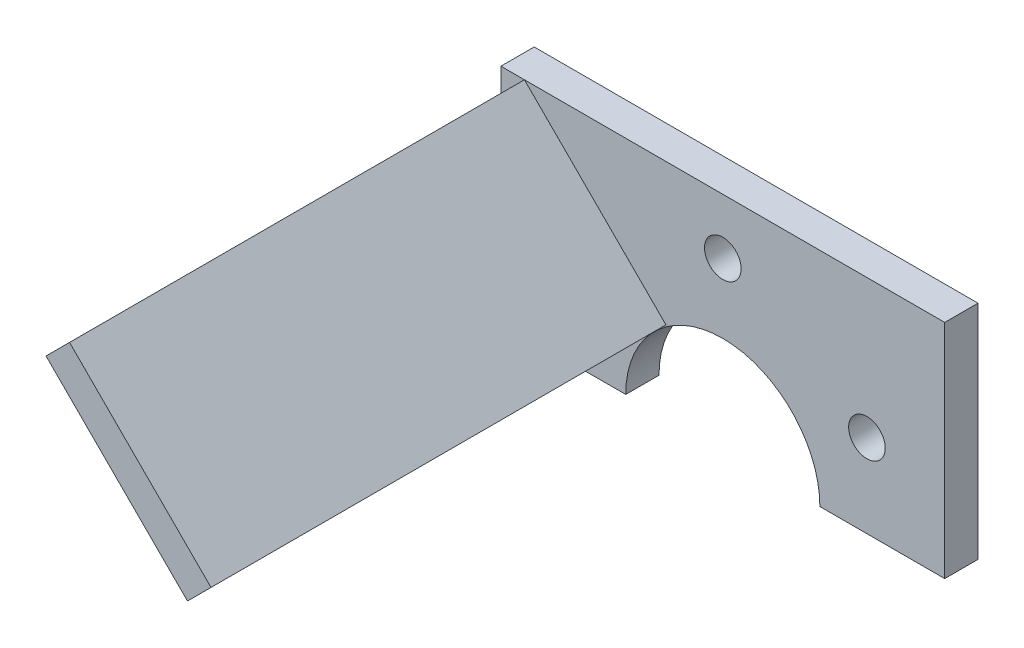
ISO-10303-21;
HEADER;
FILE_DESCRIPTION(('STEP AP214'),'2;1');
FILE_NAME('part.step','',(''),(''),'','','');
FILE_SCHEMA(('AUTOMOTIVE_DESIGN { 1 0 10303 214 1 1 1 1 }'));
ENDSEC;
DATA;
#1=APPLICATION_CONTEXT('core data for automotive mechanical design processes');
#2=APPLICATION_PROTOCOL_DEFINITION('international standard','automotive_design',2000,#1);
#3=PRODUCT_CONTEXT('',#1,'mechanical');
#4=PRODUCT('Part','Part','',(#3));
#5=PRODUCT_RELATED_PRODUCT_CATEGORY('part','',(#4));
#6=PRODUCT_DEFINITION_FORMATION('','',#4);
#7=PRODUCT_DEFINITION_CONTEXT('part definition',#1,'design');
#8=PRODUCT_DEFINITION('design','',#6,#7);
#9=PRODUCT_DEFINITION_SHAPE('','',#8);
#10=(LENGTH_UNIT() NAMED_UNIT(*) SI_UNIT(.MILLI.,.METRE.));
#11=(NAMED_UNIT(*) PLANE_ANGLE_UNIT() SI_UNIT($,.RADIAN.));
#12=(NAMED_UNIT(*) SI_UNIT($,.STERADIAN.) SOLID_ANGLE_UNIT());
#13=UNCERTAINTY_MEASURE_WITH_UNIT(LENGTH_MEASURE(1.E-05),#10,'distance_accuracy_value','');
#14=(GEOMETRIC_REPRESENTATION_CONTEXT(3) GLOBAL_UNCERTAINTY_ASSIGNED_CONTEXT((#13)) GLOBAL_UNIT_ASSIGNED_CONTEXT((#10,
#11,#12)) REPRESENTATION_CONTEXT('',''));
#15=CARTESIAN_POINT('',(0.,0.,0.));
#16=DIRECTION('',(0.,0.,1.));
#17=DIRECTION('',(1.,0.,0.));
#18=AXIS2_PLACEMENT_3D('',#15,#16,#17);
#19=CARTESIAN_POINT('',(-35.7573593128803,40.,88.));
#20=DIRECTION('',(-0.707106781186551,-0.707106781186544,0.));
#21=DIRECTION('',(0.707106781186544,-0.707106781186551,0.));
#22=AXIS2_PLACEMENT_3D('',#19,#20,#21);
#23=PLANE('',#22);
#24=DIRECTION('',(-0.707106781186544,0.707106781186551,0.));
#25=VECTOR('',#24,1.);
#26=CARTESIAN_POINT('',(-35.7573593128803,40.,0.));
#27=LINE('',#26,#25);
#28=CARTESIAN_POINT('',(-10.2530483272049,14.4956890143243,0.));
#29=VERTEX_POINT('',#28);
#30=CARTESIAN_POINT('',(-35.7573593128803,40.,0.));
#31=VERTEX_POINT('',#30);
#32=EDGE_CURVE('E115',#29,#31,#27,.T.);
#33=ORIENTED_EDGE('',*,*,#32,.T.);
#34=DIRECTION('',(0.,0.,-1.));
#35=VECTOR('',#34,1.);
#36=CARTESIAN_POINT('',(-35.7573593128803,40.,88.));
#37=LINE('',#36,#35);
#38=CARTESIAN_POINT('',(-35.7573593128803,40.,88.));
#39=VERTEX_POINT('',#38);
#40=EDGE_CURVE('E12',#39,#31,#37,.T.);
#41=ORIENTED_EDGE('',*,*,#40,.F.);
#42=DIRECTION('',(-0.707106781186544,0.707106781186551,0.));
#43=VECTOR('',#42,1.);
#44=CARTESIAN_POINT('',(-35.7573593128803,40.,88.));
#45=LINE('',#44,#43);
#46=CARTESIAN_POINT('',(-10.2530483272049,14.4956890143243,88.));
#47=VERTEX_POINT('',#46);
#48=EDGE_CURVE('E102',#47,#39,#45,.T.);
#49=ORIENTED_EDGE('',*,*,#48,.F.);
#50=DIRECTION('',(0.,0.,-1.));
#51=VECTOR('',#50,1.);
#52=CARTESIAN_POINT('',(-10.2530483272049,14.4956890143243,88.));
#53=LINE('',#52,#51);
#54=EDGE_CURVE('E107',#47,#29,#53,.T.);
#55=ORIENTED_EDGE('',*,*,#54,.T.);
#56=EDGE_LOOP('',(#33,#41,#49,#55));
#57=FACE_BOUND('',#56,.T.);
#58=ADVANCED_FACE('F47',(#57),#23,.F.);
#59=CARTESIAN_POINT('',(-35.7573593128803,40.,88.));
#60=DIRECTION('',(0.707106781186544,-0.707106781186551,0.));
#61=DIRECTION('',(0.707106781186551,0.707106781186544,0.));
#62=AXIS2_PLACEMENT_3D('',#59,#60,#61);
#63=PLANE('',#62);
#64=DIRECTION('',(-0.707106781186551,-0.707106781186544,0.));
#65=VECTOR('',#64,1.);
#66=CARTESIAN_POINT('',(-35.7573593128803,40.,0.));
#67=LINE('',#66,#65);
#68=CARTESIAN_POINT('',(-39.9999999999996,35.7573593128807,0.));
#69=VERTEX_POINT('',#68);
#70=EDGE_CURVE('E106',#31,#69,#67,.T.);
#71=ORIENTED_EDGE('',*,*,#70,.T.);
#72=DIRECTION('',(0.,0.,-1.));
#73=VECTOR('',#72,1.);
#74=CARTESIAN_POINT('',(-39.9999999999996,35.7573593128807,88.));
#75=LINE('',#74,#73);
#76=CARTESIAN_POINT('',(-39.9999999999996,35.7573593128807,88.));
#77=VERTEX_POINT('',#76);
#78=EDGE_CURVE('E55',#77,#69,#75,.T.);
#79=ORIENTED_EDGE('',*,*,#78,.F.);
#80=DIRECTION('',(-0.707106781186551,-0.707106781186544,0.));
#81=VECTOR('',#80,1.);
#82=CARTESIAN_POINT('',(-35.7573593128803,40.,88.));
#83=LINE('',#82,#81);
#84=EDGE_CURVE('E89',#39,#77,#83,.T.);
#85=ORIENTED_EDGE('',*,*,#84,.F.);
#86=ORIENTED_EDGE('',*,*,#40,.T.);
#87=EDGE_LOOP('',(#71,#79,#85,#86));
#88=FACE_BOUND('',#87,.T.);
#89=ADVANCED_FACE('F105',(#88),#63,.F.);
#90=CARTESIAN_POINT('',(-39.9999999999996,35.7573593128807,88.));
#91=DIRECTION('',(0.707106781186551,0.707106781186544,0.));
#92=DIRECTION('',(-0.707106781186544,0.707106781186551,0.));
#93=AXIS2_PLACEMENT_3D('',#90,#91,#92);
#94=PLANE('',#93);
#95=DIRECTION('',(0.707106781186544,-0.707106781186551,0.));
#96=VECTOR('',#95,1.);
#97=CARTESIAN_POINT('',(-39.9999999999996,35.7573593128807,0.));
#98=LINE('',#97,#96);
#99=CARTESIAN_POINT('',(-14.4956890143242,10.253048327205,0.));
#100=VERTEX_POINT('',#99);
#101=EDGE_CURVE('E112',#69,#100,#98,.T.);
#102=ORIENTED_EDGE('',*,*,#101,.T.);
#103=DIRECTION('',(0.,0.,-1.));
#104=VECTOR('',#103,1.);
#105=CARTESIAN_POINT('',(-14.4956890143242,10.253048327205,88.));
#106=LINE('',#105,#104);
#107=CARTESIAN_POINT('',(-14.4956890143242,10.253048327205,88.));
#108=VERTEX_POINT('',#107);
#109=EDGE_CURVE('E98',#108,#100,#106,.T.);
#110=ORIENTED_EDGE('',*,*,#109,.F.);
#111=DIRECTION('',(0.707106781186544,-0.707106781186551,0.));
#112=VECTOR('',#111,1.);
#113=CARTESIAN_POINT('',(-39.9999999999996,35.7573593128807,88.));
#114=LINE('',#113,#112);
#115=EDGE_CURVE('E94',#77,#108,#114,.T.);
#116=ORIENTED_EDGE('',*,*,#115,.F.);
#117=ORIENTED_EDGE('',*,*,#78,.T.);
#118=EDGE_LOOP('',(#102,#110,#116,#117));
#119=FACE_BOUND('',#118,.T.);
#120=ADVANCED_FACE('F96',(#119),#94,.F.);
#121=CARTESIAN_POINT('',(-10.2530483272049,14.4956890143243,88.));
#122=DIRECTION('',(-0.707106781186544,0.707106781186551,0.));
#123=DIRECTION('',(-0.707106781186551,-0.707106781186544,0.));
#124=AXIS2_PLACEMENT_3D('',#121,#122,#123);
#125=PLANE('',#124);
#126=DIRECTION('',(0.707106781186551,0.707106781186544,0.));
#127=VECTOR('',#126,1.);
#128=CARTESIAN_POINT('',(-10.2530483272049,14.4956890143243,0.));
#129=LINE('',#128,#127);
#130=EDGE_CURVE('E79',#100,#29,#129,.T.);
#131=ORIENTED_EDGE('',*,*,#130,.T.);
#132=ORIENTED_EDGE('',*,*,#54,.F.);
#133=DIRECTION('',(0.707106781186551,0.707106781186544,0.));
#134=VECTOR('',#133,1.);
#135=CARTESIAN_POINT('',(-10.2530483272049,14.4956890143243,88.));
#136=LINE('',#135,#134);
#137=EDGE_CURVE('E63',#108,#47,#136,.T.);
#138=ORIENTED_EDGE('',*,*,#137,.F.);
#139=ORIENTED_EDGE('',*,*,#109,.T.);
#140=EDGE_LOOP('',(#131,#132,#138,#139));
#141=FACE_BOUND('',#140,.T.);
#142=ADVANCED_FACE('F126',(#141),#125,.F.);
#143=CARTESIAN_POINT('',(0.,0.,88.));
#144=DIRECTION('',(0.,0.,-1.));
#145=DIRECTION('',(-1.,0.,0.));
#146=AXIS2_PLACEMENT_3D('',#143,#144,#145);
#147=PLANE('',#146);
#148=ORIENTED_EDGE('',*,*,#48,.T.);
#149=ORIENTED_EDGE('',*,*,#84,.T.);
#150=ORIENTED_EDGE('',*,*,#115,.T.);
#151=ORIENTED_EDGE('',*,*,#137,.T.);
#152=EDGE_LOOP('',(#148,#149,#150,#151));
#153=FACE_BOUND('',#152,.T.);
#154=ADVANCED_FACE('F100',(#153),#147,.F.);
#155=CARTESIAN_POINT('',(0.,0.,0.));
#156=DIRECTION('',(0.,0.,-1.));
#157=DIRECTION('',(-1.,0.,0.));
#158=AXIS2_PLACEMENT_3D('',#155,#156,#157);
#159=PLANE('',#158);
#160=ORIENTED_EDGE('',*,*,#32,.F.);
#161=ORIENTED_EDGE('',*,*,#130,.F.);
#162=ORIENTED_EDGE('',*,*,#101,.F.);
#163=ORIENTED_EDGE('',*,*,#70,.F.);
#164=EDGE_LOOP('',(#160,#161,#162,#163));
#165=FACE_BOUND('',#164,.T.);
#166=ADVANCED_FACE('F120',(#165),#159,.T.);
#167=CLOSED_SHELL('',(#58,#89,#120,#142,#154,#166));
#168=MANIFOLD_SOLID_BREP('B2',#167);
#169=CARTESIAN_POINT('',(0.,0.,6.));
#170=DIRECTION('',(0.,0.,1.));
#171=DIRECTION('',(1.,0.,0.));
#172=AXIS2_PLACEMENT_3D('',#169,#170,#171);
#173=PLANE('',#172);
#174=CARTESIAN_POINT('',(25.9807621135338,15.0000000000011,6.));
#175=DIRECTION('',(0.,0.,1.));
#176=DIRECTION('',(1.,0.,0.));
#177=AXIS2_PLACEMENT_3D('',#174,#175,#176);
#178=CIRCLE('',#177,3.30000000000036);
#179=CARTESIAN_POINT('',(29.2807621135342,15.0000000000011,6.));
#180=VERTEX_POINT('',#179);
#181=EDGE_CURVE('E324',#180,#180,#178,.T.);
#182=ORIENTED_EDGE('',*,*,#181,.F.);
#183=EDGE_LOOP('',(#182));
#184=FACE_BOUND('',#183,.T.);
#185=DIRECTION('',(1.,0.,0.));
#186=VECTOR('',#185,1.);
#187=CARTESIAN_POINT('',(17.5,0.,6.));
#188=LINE('',#187,#186);
#189=CARTESIAN_POINT('',(17.5,0.,6.));
#190=VERTEX_POINT('',#189);
#191=CARTESIAN_POINT('',(40.,0.,6.));
#192=VERTEX_POINT('',#191);
#193=EDGE_CURVE('E269',#190,#192,#188,.T.);
#194=ORIENTED_EDGE('',*,*,#193,.T.);
#195=DIRECTION('',(0.,1.,0.));
#196=VECTOR('',#195,1.);
#197=CARTESIAN_POINT('',(40.,40.,6.));
#198=LINE('',#197,#196);
#199=CARTESIAN_POINT('',(40.,40.,6.));
#200=VERTEX_POINT('',#199);
#201=EDGE_CURVE('E250',#192,#200,#198,.T.);
#202=ORIENTED_EDGE('',*,*,#201,.T.);
#203=DIRECTION('',(-1.,0.,0.));
#204=VECTOR('',#203,1.);
#205=CARTESIAN_POINT('',(-40.,40.,6.));
#206=LINE('',#205,#204);
#207=CARTESIAN_POINT('',(-40.,40.,6.));
#208=VERTEX_POINT('',#207);
#209=EDGE_CURVE('E248',#200,#208,#206,.T.);
#210=ORIENTED_EDGE('',*,*,#209,.T.);
#211=DIRECTION('',(0.,-1.,0.));
#212=VECTOR('',#211,1.);
#213=CARTESIAN_POINT('',(-40.,40.,6.));
#214=LINE('',#213,#212);
#215=CARTESIAN_POINT('',(-40.,0.,6.));
#216=VERTEX_POINT('',#215);
#217=EDGE_CURVE('E230',#208,#216,#214,.T.);
#218=ORIENTED_EDGE('',*,*,#217,.T.);
#219=DIRECTION('',(1.,0.,0.));
#220=VECTOR('',#219,1.);
#221=CARTESIAN_POINT('',(-40.,0.,6.));
#222=LINE('',#221,#220);
#223=CARTESIAN_POINT('',(-17.5,0.,6.));
#224=VERTEX_POINT('',#223);
#225=EDGE_CURVE('E239',#216,#224,#222,.T.);
#226=ORIENTED_EDGE('',*,*,#225,.T.);
#227=CARTESIAN_POINT('',(0.,0.,6.));
#228=DIRECTION('',(0.,0.,-1.));
#229=DIRECTION('',(1.,0.,0.));
#230=AXIS2_PLACEMENT_3D('',#227,#228,#229);
#231=CIRCLE('',#230,17.5);
#232=EDGE_CURVE('E242',#224,#190,#231,.T.);
#233=ORIENTED_EDGE('',*,*,#232,.T.);
#234=EDGE_LOOP('',(#194,#202,#210,#218,#226,#233));
#235=FACE_BOUND('',#234,.T.);
#236=CARTESIAN_POINT('',(0.,30.,6.));
#237=DIRECTION('',(0.,0.,1.));
#238=DIRECTION('',(1.,0.,0.));
#239=AXIS2_PLACEMENT_3D('',#236,#237,#238);
#240=CIRCLE('',#239,3.3);
#241=CARTESIAN_POINT('',(3.3,30.,6.));
#242=VERTEX_POINT('',#241);
#243=EDGE_CURVE('E258',#242,#242,#240,.T.);
#244=ORIENTED_EDGE('',*,*,#243,.F.);
#245=EDGE_LOOP('',(#244));
#246=FACE_BOUND('',#245,.T.);
#247=CARTESIAN_POINT('',(-25.9807621135325,14.9999999999989,6.));
#248=DIRECTION('',(0.,0.,1.));
#249=DIRECTION('',(1.,0.,0.));
#250=AXIS2_PLACEMENT_3D('',#247,#248,#249);
#251=CIRCLE('',#250,3.30000000000129);
#252=CARTESIAN_POINT('',(-22.6807621135312,14.9999999999989,6.));
#253=VERTEX_POINT('',#252);
#254=EDGE_CURVE('E315',#253,#253,#251,.T.);
#255=ORIENTED_EDGE('',*,*,#254,.F.);
#256=EDGE_LOOP('',(#255));
#257=FACE_BOUND('',#256,.T.);
#258=ADVANCED_FACE('F171',(#184,#235,#246,#257),#173,.T.);
#259=CARTESIAN_POINT('',(0.,0.,0.));
#260=DIRECTION('',(0.,0.,1.));
#261=DIRECTION('',(1.,0.,0.));
#262=AXIS2_PLACEMENT_3D('',#259,#260,#261);
#263=PLANE('',#262);
#264=DIRECTION('',(1.,0.,0.));
#265=VECTOR('',#264,1.);
#266=CARTESIAN_POINT('',(17.5,0.,0.));
#267=LINE('',#266,#265);
#268=CARTESIAN_POINT('',(17.5,0.,0.));
#269=VERTEX_POINT('',#268);
#270=CARTESIAN_POINT('',(40.,0.,0.));
#271=VERTEX_POINT('',#270);
#272=EDGE_CURVE('E255',#269,#271,#267,.T.);
#273=ORIENTED_EDGE('',*,*,#272,.F.);
#274=CARTESIAN_POINT('',(0.,0.,0.));
#275=DIRECTION('',(0.,0.,-1.));
#276=DIRECTION('',(1.,0.,0.));
#277=AXIS2_PLACEMENT_3D('',#274,#275,#276);
#278=CIRCLE('',#277,17.5);
#279=CARTESIAN_POINT('',(-17.5,0.,0.));
#280=VERTEX_POINT('',#279);
#281=EDGE_CURVE('E267',#280,#269,#278,.T.);
#282=ORIENTED_EDGE('',*,*,#281,.F.);
#283=DIRECTION('',(1.,0.,0.));
#284=VECTOR('',#283,1.);
#285=CARTESIAN_POINT('',(-40.,0.,0.));
#286=LINE('',#285,#284);
#287=CARTESIAN_POINT('',(-40.,0.,0.));
#288=VERTEX_POINT('',#287);
#289=EDGE_CURVE('E265',#288,#280,#286,.T.);
#290=ORIENTED_EDGE('',*,*,#289,.F.);
#291=DIRECTION('',(0.,-1.,0.));
#292=VECTOR('',#291,1.);
#293=CARTESIAN_POINT('',(-40.,40.,0.));
#294=LINE('',#293,#292);
#295=CARTESIAN_POINT('',(-40.,40.,0.));
#296=VERTEX_POINT('',#295);
#297=EDGE_CURVE('E233',#296,#288,#294,.T.);
#298=ORIENTED_EDGE('',*,*,#297,.F.);
#299=DIRECTION('',(-1.,0.,0.));
#300=VECTOR('',#299,1.);
#301=CARTESIAN_POINT('',(-40.,40.,0.));
#302=LINE('',#301,#300);
#303=CARTESIAN_POINT('',(40.,40.,0.));
#304=VERTEX_POINT('',#303);
#305=EDGE_CURVE('E261',#304,#296,#302,.T.);
#306=ORIENTED_EDGE('',*,*,#305,.F.);
#307=DIRECTION('',(0.,1.,0.));
#308=VECTOR('',#307,1.);
#309=CARTESIAN_POINT('',(40.,40.,0.));
#310=LINE('',#309,#308);
#311=EDGE_CURVE('E257',#271,#304,#310,.T.);
#312=ORIENTED_EDGE('',*,*,#311,.F.);
#313=EDGE_LOOP('',(#273,#282,#290,#298,#306,#312));
#314=FACE_BOUND('',#313,.T.);
#315=CARTESIAN_POINT('',(0.,30.,0.));
#316=DIRECTION('',(0.,0.,1.));
#317=DIRECTION('',(1.,0.,0.));
#318=AXIS2_PLACEMENT_3D('',#315,#316,#317);
#319=CIRCLE('',#318,3.3);
#320=CARTESIAN_POINT('',(3.3,30.,0.));
#321=VERTEX_POINT('',#320);
#322=EDGE_CURVE('E327',#321,#321,#319,.T.);
#323=ORIENTED_EDGE('',*,*,#322,.T.);
#324=EDGE_LOOP('',(#323));
#325=FACE_BOUND('',#324,.T.);
#326=CARTESIAN_POINT('',(25.9807621135338,15.0000000000011,0.));
#327=DIRECTION('',(0.,0.,1.));
#328=DIRECTION('',(1.,0.,0.));
#329=AXIS2_PLACEMENT_3D('',#326,#327,#328);
#330=CIRCLE('',#329,3.30000000000036);
#331=CARTESIAN_POINT('',(29.2807621135342,15.0000000000011,0.));
#332=VERTEX_POINT('',#331);
#333=EDGE_CURVE('E321',#332,#332,#330,.T.);
#334=ORIENTED_EDGE('',*,*,#333,.T.);
#335=EDGE_LOOP('',(#334));
#336=FACE_BOUND('',#335,.T.);
#337=CARTESIAN_POINT('',(-25.9807621135325,14.9999999999989,0.));
#338=DIRECTION('',(0.,0.,1.));
#339=DIRECTION('',(1.,0.,0.));
#340=AXIS2_PLACEMENT_3D('',#337,#338,#339);
#341=CIRCLE('',#340,3.30000000000129);
#342=CARTESIAN_POINT('',(-22.6807621135312,14.9999999999989,0.));
#343=VERTEX_POINT('',#342);
#344=EDGE_CURVE('E318',#343,#343,#341,.T.);
#345=ORIENTED_EDGE('',*,*,#344,.T.);
#346=EDGE_LOOP('',(#345));
#347=FACE_BOUND('',#346,.T.);
#348=ADVANCED_FACE('F280',(#314,#325,#336,#347),#263,.F.);
#349=CARTESIAN_POINT('',(17.5,0.,6.));
#350=DIRECTION('',(0.,1.,0.));
#351=DIRECTION('',(-1.,0.,0.));
#352=AXIS2_PLACEMENT_3D('',#349,#350,#351);
#353=PLANE('',#352);
#354=ORIENTED_EDGE('',*,*,#272,.T.);
#355=DIRECTION('',(0.,0.,-1.));
#356=VECTOR('',#355,1.);
#357=CARTESIAN_POINT('',(40.,0.,6.));
#358=LINE('',#357,#356);
#359=EDGE_CURVE('E45',#192,#271,#358,.T.);
#360=ORIENTED_EDGE('',*,*,#359,.F.);
#361=ORIENTED_EDGE('',*,*,#193,.F.);
#362=DIRECTION('',(0.,0.,-1.));
#363=VECTOR('',#362,1.);
#364=CARTESIAN_POINT('',(17.5,0.,6.));
#365=LINE('',#364,#363);
#366=EDGE_CURVE('E188',#190,#269,#365,.T.);
#367=ORIENTED_EDGE('',*,*,#366,.T.);
#368=EDGE_LOOP('',(#354,#360,#361,#367));
#369=FACE_BOUND('',#368,.T.);
#370=ADVANCED_FACE('F173',(#369),#353,.F.);
#371=CARTESIAN_POINT('',(40.,40.,6.));
#372=DIRECTION('',(-1.,0.,0.));
#373=DIRECTION('',(0.,-1.,0.));
#374=AXIS2_PLACEMENT_3D('',#371,#372,#373);
#375=PLANE('',#374);
#376=ORIENTED_EDGE('',*,*,#311,.T.);
#377=DIRECTION('',(0.,0.,-1.));
#378=VECTOR('',#377,1.);
#379=CARTESIAN_POINT('',(40.,40.,6.));
#380=LINE('',#379,#378);
#381=EDGE_CURVE('E180',#200,#304,#380,.T.);
#382=ORIENTED_EDGE('',*,*,#381,.F.);
#383=ORIENTED_EDGE('',*,*,#201,.F.);
#384=ORIENTED_EDGE('',*,*,#359,.T.);
#385=EDGE_LOOP('',(#376,#382,#383,#384));
#386=FACE_BOUND('',#385,.T.);
#387=ADVANCED_FACE('F277',(#386),#375,.F.);
#388=CARTESIAN_POINT('',(-40.,40.,6.));
#389=DIRECTION('',(0.,-1.,0.));
#390=DIRECTION('',(1.,0.,0.));
#391=AXIS2_PLACEMENT_3D('',#388,#389,#390);
#392=PLANE('',#391);
#393=ORIENTED_EDGE('',*,*,#305,.T.);
#394=DIRECTION('',(0.,0.,-1.));
#395=VECTOR('',#394,1.);
#396=CARTESIAN_POINT('',(-40.,40.,6.));
#397=LINE('',#396,#395);
#398=EDGE_CURVE('E236',#208,#296,#397,.T.);
#399=ORIENTED_EDGE('',*,*,#398,.F.);
#400=ORIENTED_EDGE('',*,*,#209,.F.);
#401=ORIENTED_EDGE('',*,*,#381,.T.);
#402=EDGE_LOOP('',(#393,#399,#400,#401));
#403=FACE_BOUND('',#402,.T.);
#404=ADVANCED_FACE('F273',(#403),#392,.F.);
#405=CARTESIAN_POINT('',(-40.,40.,6.));
#406=DIRECTION('',(1.,0.,0.));
#407=DIRECTION('',(0.,1.,0.));
#408=AXIS2_PLACEMENT_3D('',#405,#406,#407);
#409=PLANE('',#408);
#410=ORIENTED_EDGE('',*,*,#297,.T.);
#411=DIRECTION('',(0.,0.,-1.));
#412=VECTOR('',#411,1.);
#413=CARTESIAN_POINT('',(-40.,0.,6.));
#414=LINE('',#413,#412);
#415=EDGE_CURVE('E226',#216,#288,#414,.T.);
#416=ORIENTED_EDGE('',*,*,#415,.F.);
#417=ORIENTED_EDGE('',*,*,#217,.F.);
#418=ORIENTED_EDGE('',*,*,#398,.T.);
#419=EDGE_LOOP('',(#410,#416,#417,#418));
#420=FACE_BOUND('',#419,.T.);
#421=ADVANCED_FACE('F228',(#420),#409,.F.);
#422=CARTESIAN_POINT('',(-40.,0.,6.));
#423=DIRECTION('',(0.,1.,0.));
#424=DIRECTION('',(-1.,0.,0.));
#425=AXIS2_PLACEMENT_3D('',#422,#423,#424);
#426=PLANE('',#425);
#427=ORIENTED_EDGE('',*,*,#289,.T.);
#428=DIRECTION('',(0.,0.,-1.));
#429=VECTOR('',#428,1.);
#430=CARTESIAN_POINT('',(-17.5,0.,6.));
#431=LINE('',#430,#429);
#432=EDGE_CURVE('E207',#224,#280,#431,.T.);
#433=ORIENTED_EDGE('',*,*,#432,.F.);
#434=ORIENTED_EDGE('',*,*,#225,.F.);
#435=ORIENTED_EDGE('',*,*,#415,.T.);
#436=EDGE_LOOP('',(#427,#433,#434,#435));
#437=FACE_BOUND('',#436,.T.);
#438=ADVANCED_FACE('F240',(#437),#426,.F.);
#439=CARTESIAN_POINT('',(0.,0.,6.));
#440=DIRECTION('',(0.,0.,-1.));
#441=DIRECTION('',(-1.,0.,0.));
#442=AXIS2_PLACEMENT_3D('',#439,#440,#441);
#443=CYLINDRICAL_SURFACE('',#442,17.5);
#444=ORIENTED_EDGE('',*,*,#281,.T.);
#445=ORIENTED_EDGE('',*,*,#366,.F.);
#446=ORIENTED_EDGE('',*,*,#232,.F.);
#447=ORIENTED_EDGE('',*,*,#432,.T.);
#448=EDGE_LOOP('',(#444,#445,#446,#447));
#449=FACE_BOUND('',#448,.T.);
#450=ADVANCED_FACE('F283',(#449),#443,.F.);
#451=CARTESIAN_POINT('',(0.,30.,6.));
#452=DIRECTION('',(0.,0.,-1.));
#453=DIRECTION('',(-1.,0.,0.));
#454=AXIS2_PLACEMENT_3D('',#451,#452,#453);
#455=CYLINDRICAL_SURFACE('',#454,3.3);
#456=ORIENTED_EDGE('',*,*,#243,.T.);
#457=EDGE_LOOP('',(#456));
#458=FACE_BOUND('',#457,.T.);
#459=ORIENTED_EDGE('',*,*,#322,.F.);
#460=EDGE_LOOP('',(#459));
#461=FACE_BOUND('',#460,.T.);
#462=ADVANCED_FACE('F285',(#458,#461),#455,.F.);
#463=CARTESIAN_POINT('',(25.9807621135338,15.0000000000011,6.));
#464=DIRECTION('',(0.,0.,-1.));
#465=DIRECTION('',(-1.,0.,0.));
#466=AXIS2_PLACEMENT_3D('',#463,#464,#465);
#467=CYLINDRICAL_SURFACE('',#466,3.30000000000036);
#468=ORIENTED_EDGE('',*,*,#181,.T.);
#469=EDGE_LOOP('',(#468));
#470=FACE_BOUND('',#469,.T.);
#471=ORIENTED_EDGE('',*,*,#333,.F.);
#472=EDGE_LOOP('',(#471));
#473=FACE_BOUND('',#472,.T.);
#474=ADVANCED_FACE('F291',(#470,#473),#467,.F.);
#475=CARTESIAN_POINT('',(-25.9807621135325,14.9999999999989,6.));
#476=DIRECTION('',(0.,0.,-1.));
#477=DIRECTION('',(-1.,0.,0.));
#478=AXIS2_PLACEMENT_3D('',#475,#476,#477);
#479=CYLINDRICAL_SURFACE('',#478,3.30000000000129);
#480=ORIENTED_EDGE('',*,*,#254,.T.);
#481=EDGE_LOOP('',(#480));
#482=FACE_BOUND('',#481,.T.);
#483=ORIENTED_EDGE('',*,*,#344,.F.);
#484=EDGE_LOOP('',(#483));
#485=FACE_BOUND('',#484,.T.);
#486=ADVANCED_FACE('F306',(#482,#485),#479,.F.);
#487=CLOSED_SHELL('',(#258,#348,#370,#387,#404,#421,#438,#450,#462,#474,#486));
#488=MANIFOLD_SOLID_BREP('B6_NOT_SHOWN',#487);
#489=ADVANCED_BREP_SHAPE_REPRESENTATION('',(#18,#168,#488),#14);
#490=SHAPE_DEFINITION_REPRESENTATION(#9,#489);
ENDSEC;
END-ISO-10303-21;
